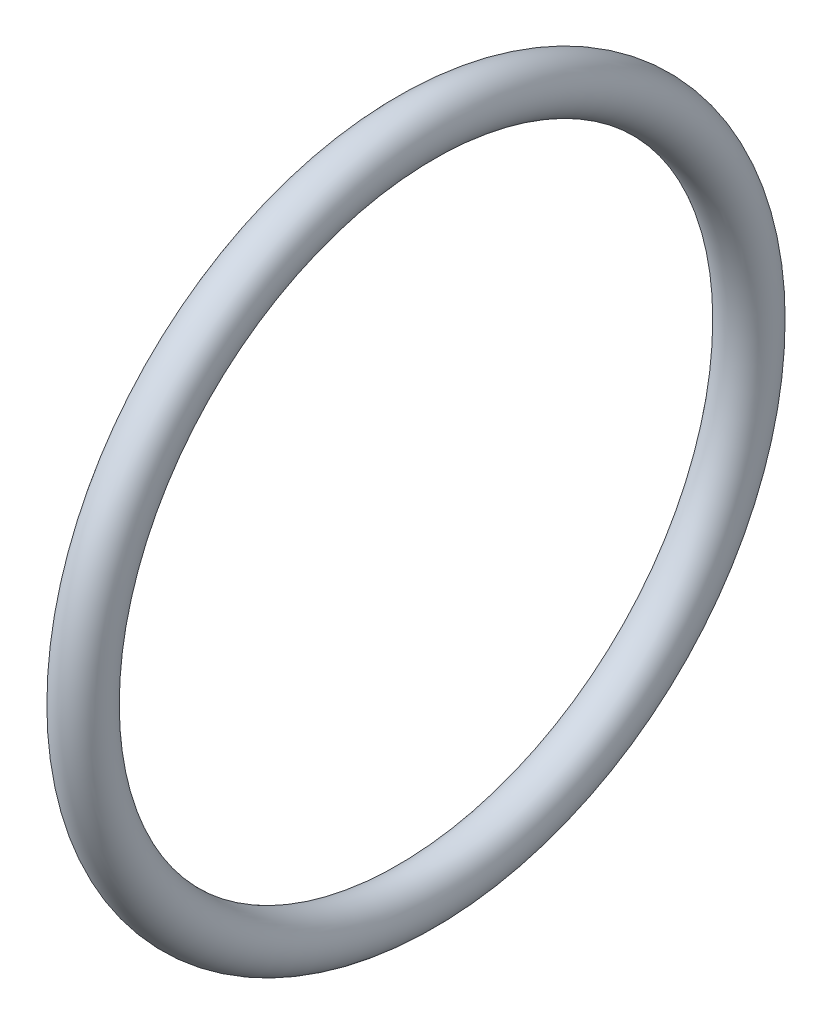
ISO-10303-21;
HEADER;
FILE_DESCRIPTION(('STEP AP214'),'2;1');
FILE_NAME('part.step','',(''),(''),'','','');
FILE_SCHEMA(('AUTOMOTIVE_DESIGN { 1 0 10303 214 1 1 1 1 }'));
ENDSEC;
DATA;
#1=APPLICATION_CONTEXT('core data for automotive mechanical design processes');
#2=APPLICATION_PROTOCOL_DEFINITION('international standard','automotive_design',2000,#1);
#3=PRODUCT_CONTEXT('',#1,'mechanical');
#4=PRODUCT('Part','Part','',(#3));
#5=PRODUCT_RELATED_PRODUCT_CATEGORY('part','',(#4));
#6=PRODUCT_DEFINITION_FORMATION('','',#4);
#7=PRODUCT_DEFINITION_CONTEXT('part definition',#1,'design');
#8=PRODUCT_DEFINITION('design','',#6,#7);
#9=PRODUCT_DEFINITION_SHAPE('','',#8);
#10=(LENGTH_UNIT() NAMED_UNIT(*) SI_UNIT(.MILLI.,.METRE.));
#11=(NAMED_UNIT(*) PLANE_ANGLE_UNIT() SI_UNIT($,.RADIAN.));
#12=(NAMED_UNIT(*) SI_UNIT($,.STERADIAN.) SOLID_ANGLE_UNIT());
#13=UNCERTAINTY_MEASURE_WITH_UNIT(LENGTH_MEASURE(1.E-05),#10,'distance_accuracy_value','');
#14=(GEOMETRIC_REPRESENTATION_CONTEXT(3) GLOBAL_UNCERTAINTY_ASSIGNED_CONTEXT((#13)) GLOBAL_UNIT_ASSIGNED_CONTEXT((#10,
#11,#12)) REPRESENTATION_CONTEXT('',''));
#15=CARTESIAN_POINT('',(0.,0.,0.));
#16=DIRECTION('',(0.,0.,1.));
#17=DIRECTION('',(1.,0.,0.));
#18=AXIS2_PLACEMENT_3D('',#15,#16,#17);
#19=CARTESIAN_POINT('',(0.,0.,0.));
#20=DIRECTION('',(-1.,0.,0.));
#21=DIRECTION('',(0.,0.,1.));
#22=AXIS2_PLACEMENT_3D('',#19,#20,#21);
#23=TOROIDAL_SURFACE('',#22,82.55,6.34999999999999);
#24=CARTESIAN_POINT('',(0.,0.,88.9));
#25=VERTEX_POINT('',#24);
#26=VERTEX_LOOP('',#25);
#27=FACE_BOUND('',#26,.T.);
#28=ADVANCED_FACE('F29',(#27),#23,.T.);
#29=CLOSED_SHELL('',(#28));
#30=MANIFOLD_SOLID_BREP('B2',#29);
#31=ADVANCED_BREP_SHAPE_REPRESENTATION('',(#18,#30),#14);
#32=SHAPE_DEFINITION_REPRESENTATION(#9,#31);
ENDSEC;
END-ISO-10303-21;
